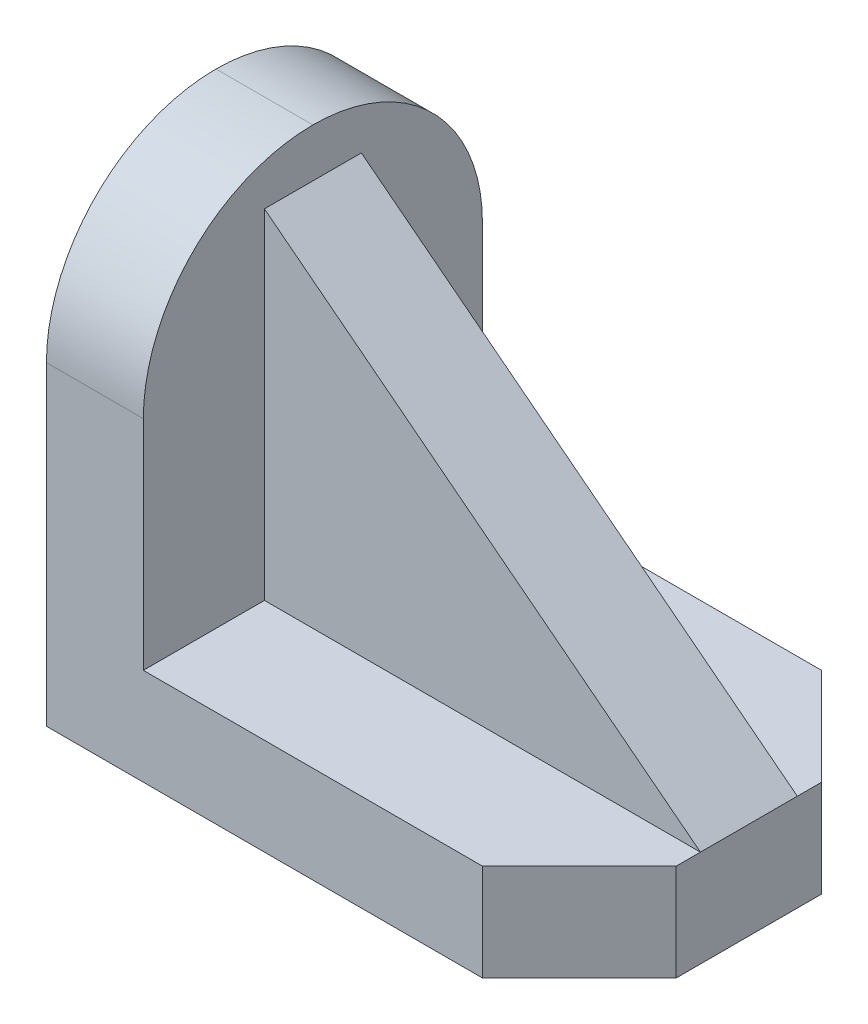
ISO-10303-21;
HEADER;
FILE_DESCRIPTION(('STEP AP214'),'2;1');
FILE_NAME('part.step','',(''),(''),'','','');
FILE_SCHEMA(('AUTOMOTIVE_DESIGN { 1 0 10303 214 1 1 1 1 }'));
ENDSEC;
DATA;
#1=APPLICATION_CONTEXT('core data for automotive mechanical design processes');
#2=APPLICATION_PROTOCOL_DEFINITION('international standard','automotive_design',2000,#1);
#3=PRODUCT_CONTEXT('',#1,'mechanical');
#4=PRODUCT('Part','Part','',(#3));
#5=PRODUCT_RELATED_PRODUCT_CATEGORY('part','',(#4));
#6=PRODUCT_DEFINITION_FORMATION('','',#4);
#7=PRODUCT_DEFINITION_CONTEXT('part definition',#1,'design');
#8=PRODUCT_DEFINITION('design','',#6,#7);
#9=PRODUCT_DEFINITION_SHAPE('','',#8);
#10=(LENGTH_UNIT() NAMED_UNIT(*) SI_UNIT(.MILLI.,.METRE.));
#11=(NAMED_UNIT(*) PLANE_ANGLE_UNIT() SI_UNIT($,.RADIAN.));
#12=(NAMED_UNIT(*) SI_UNIT($,.STERADIAN.) SOLID_ANGLE_UNIT());
#13=UNCERTAINTY_MEASURE_WITH_UNIT(LENGTH_MEASURE(1.E-05),#10,'distance_accuracy_value','');
#14=(GEOMETRIC_REPRESENTATION_CONTEXT(3) GLOBAL_UNCERTAINTY_ASSIGNED_CONTEXT((#13)) GLOBAL_UNIT_ASSIGNED_CONTEXT((#10,
#11,#12)) REPRESENTATION_CONTEXT('',''));
#15=CARTESIAN_POINT('',(0.,0.,0.));
#16=DIRECTION('',(0.,0.,1.));
#17=DIRECTION('',(1.,0.,0.));
#18=AXIS2_PLACEMENT_3D('',#15,#16,#17);
#19=CARTESIAN_POINT('',(0.,30.48,0.));
#20=DIRECTION('',(0.,1.,0.));
#21=DIRECTION('',(0.,0.,1.));
#22=AXIS2_PLACEMENT_3D('',#19,#20,#21);
#23=PLANE('',#22);
#24=DIRECTION('',(0.,0.,-1.));
#25=VECTOR('',#24,1.);
#26=CARTESIAN_POINT('',(30.48,30.48,0.));
#27=LINE('',#26,#25);
#28=CARTESIAN_POINT('',(30.48,30.48,-68.58));
#29=VERTEX_POINT('',#28);
#30=CARTESIAN_POINT('',(30.48,30.48,-106.68));
#31=VERTEX_POINT('',#30);
#32=EDGE_CURVE('E158',#29,#31,#27,.T.);
#33=ORIENTED_EDGE('',*,*,#32,.F.);
#34=DIRECTION('',(1.,0.,0.));
#35=VECTOR('',#34,1.);
#36=CARTESIAN_POINT('',(0.,30.48,-68.58));
#37=LINE('',#36,#35);
#38=CARTESIAN_POINT('',(167.64,30.48,-68.58));
#39=VERTEX_POINT('',#38);
#40=EDGE_CURVE('E151',#29,#39,#37,.T.);
#41=ORIENTED_EDGE('',*,*,#40,.T.);
#42=DIRECTION('',(0.,0.,-1.));
#43=VECTOR('',#42,1.);
#44=CARTESIAN_POINT('',(167.64,30.48,-30.4800000000001));
#45=LINE('',#44,#43);
#46=CARTESIAN_POINT('',(167.64,30.48,-76.2000000000001));
#47=VERTEX_POINT('',#46);
#48=EDGE_CURVE('E168',#39,#47,#45,.T.);
#49=ORIENTED_EDGE('',*,*,#48,.T.);
#50=DIRECTION('',(-0.707106781186549,0.,-0.707106781186546));
#51=VECTOR('',#50,1.);
#52=CARTESIAN_POINT('',(167.64,30.48,-76.2000000000001));
#53=LINE('',#52,#51);
#54=CARTESIAN_POINT('',(137.16,30.48,-106.68));
#55=VERTEX_POINT('',#54);
#56=EDGE_CURVE('E172',#47,#55,#53,.T.);
#57=ORIENTED_EDGE('',*,*,#56,.T.);
#58=DIRECTION('',(-1.,0.,0.));
#59=VECTOR('',#58,1.);
#60=CARTESIAN_POINT('',(137.16,30.48,-106.68));
#61=LINE('',#60,#59);
#62=EDGE_CURVE('E174',#55,#31,#61,.T.);
#63=ORIENTED_EDGE('',*,*,#62,.T.);
#64=EDGE_LOOP('',(#33,#41,#49,#57,#63));
#65=FACE_BOUND('',#64,.T.);
#66=ADVANCED_FACE('F43',(#65),#23,.T.);
#67=CARTESIAN_POINT('',(30.48,152.4,0.));
#68=DIRECTION('',(-1.,0.,0.));
#69=DIRECTION('',(0.,0.,1.));
#70=AXIS2_PLACEMENT_3D('',#67,#68,#69);
#71=PLANE('',#70);
#72=DIRECTION('',(0.,-1.,0.));
#73=VECTOR('',#72,1.);
#74=CARTESIAN_POINT('',(30.48,152.4,-106.68));
#75=LINE('',#74,#73);
#76=CARTESIAN_POINT('',(30.48,99.06,-106.68));
#77=VERTEX_POINT('',#76);
#78=EDGE_CURVE('E159',#77,#31,#75,.T.);
#79=ORIENTED_EDGE('',*,*,#78,.F.);
#80=CARTESIAN_POINT('',(30.48,99.06,-53.34));
#81=DIRECTION('',(-1.,0.,0.));
#82=DIRECTION('',(0.,0.,1.));
#83=AXIS2_PLACEMENT_3D('',#80,#81,#82);
#84=CIRCLE('',#83,53.34);
#85=CARTESIAN_POINT('',(30.48,152.4,-53.34));
#86=VERTEX_POINT('',#85);
#87=EDGE_CURVE('E63',#77,#86,#84,.F.);
#88=ORIENTED_EDGE('',*,*,#87,.T.);
#89=CARTESIAN_POINT('',(30.48,99.06,-53.34));
#90=DIRECTION('',(-1.,0.,0.));
#91=DIRECTION('',(0.,0.,1.));
#92=AXIS2_PLACEMENT_3D('',#89,#90,#91);
#93=CIRCLE('',#92,53.34);
#94=CARTESIAN_POINT('',(30.48,99.06,0.));
#95=VERTEX_POINT('',#94);
#96=EDGE_CURVE('E56',#86,#95,#93,.F.);
#97=ORIENTED_EDGE('',*,*,#96,.T.);
#98=DIRECTION('',(0.,-1.,0.));
#99=VECTOR('',#98,1.);
#100=CARTESIAN_POINT('',(30.48,152.4,0.));
#101=LINE('',#100,#99);
#102=CARTESIAN_POINT('',(30.48,30.48,0.));
#103=VERTEX_POINT('',#102);
#104=EDGE_CURVE('E165',#95,#103,#101,.T.);
#105=ORIENTED_EDGE('',*,*,#104,.T.);
#106=CARTESIAN_POINT('',(30.48,30.48,-38.1));
#107=VERTEX_POINT('',#106);
#108=EDGE_CURVE('E144',#103,#107,#27,.T.);
#109=ORIENTED_EDGE('',*,*,#108,.T.);
#110=DIRECTION('',(0.,-1.,0.));
#111=VECTOR('',#110,1.);
#112=CARTESIAN_POINT('',(30.48,137.16,-38.1));
#113=LINE('',#112,#111);
#114=CARTESIAN_POINT('',(30.48,137.16,-38.1));
#115=VERTEX_POINT('',#114);
#116=EDGE_CURVE('E135',#115,#107,#113,.T.);
#117=ORIENTED_EDGE('',*,*,#116,.F.);
#118=DIRECTION('',(0.,0.,-1.));
#119=VECTOR('',#118,1.);
#120=CARTESIAN_POINT('',(30.48,137.16,0.));
#121=LINE('',#120,#119);
#122=CARTESIAN_POINT('',(30.48,137.16,-68.58));
#123=VERTEX_POINT('',#122);
#124=EDGE_CURVE('E141',#115,#123,#121,.T.);
#125=ORIENTED_EDGE('',*,*,#124,.T.);
#126=DIRECTION('',(0.,-1.,0.));
#127=VECTOR('',#126,1.);
#128=CARTESIAN_POINT('',(30.48,137.16,-68.58));
#129=LINE('',#128,#127);
#130=EDGE_CURVE('E148',#123,#29,#129,.T.);
#131=ORIENTED_EDGE('',*,*,#130,.T.);
#132=ORIENTED_EDGE('',*,*,#32,.T.);
#133=EDGE_LOOP('',(#79,#88,#97,#105,#109,#117,#125,#131,#132));
#134=FACE_BOUND('',#133,.T.);
#135=ADVANCED_FACE('F143',(#134),#71,.F.);
#136=CARTESIAN_POINT('',(0.,30.48,-106.68));
#137=DIRECTION('',(1.,0.,0.));
#138=DIRECTION('',(0.,0.,-1.));
#139=AXIS2_PLACEMENT_3D('',#136,#137,#138);
#140=PLANE('',#139);
#141=CARTESIAN_POINT('',(0.,99.06,-53.34));
#142=DIRECTION('',(1.,0.,0.));
#143=DIRECTION('',(0.,0.,-1.));
#144=AXIS2_PLACEMENT_3D('',#141,#142,#143);
#145=CIRCLE('',#144,53.34);
#146=CARTESIAN_POINT('',(0.,99.06,0.));
#147=VERTEX_POINT('',#146);
#148=CARTESIAN_POINT('',(0.,152.4,-53.34));
#149=VERTEX_POINT('',#148);
#150=EDGE_CURVE('E206',#147,#149,#145,.F.);
#151=ORIENTED_EDGE('',*,*,#150,.T.);
#152=CARTESIAN_POINT('',(0.,99.06,-53.34));
#153=DIRECTION('',(1.,0.,0.));
#154=DIRECTION('',(0.,0.,-1.));
#155=AXIS2_PLACEMENT_3D('',#152,#153,#154);
#156=CIRCLE('',#155,53.34);
#157=CARTESIAN_POINT('',(0.,99.06,-106.68));
#158=VERTEX_POINT('',#157);
#159=EDGE_CURVE('E208',#149,#158,#156,.F.);
#160=ORIENTED_EDGE('',*,*,#159,.T.);
#161=DIRECTION('',(0.,-1.,0.));
#162=VECTOR('',#161,1.);
#163=CARTESIAN_POINT('',(0.,30.48,-106.68));
#164=LINE('',#163,#162);
#165=CARTESIAN_POINT('',(0.,0.,-106.68));
#166=VERTEX_POINT('',#165);
#167=EDGE_CURVE('E178',#158,#166,#164,.T.);
#168=ORIENTED_EDGE('',*,*,#167,.T.);
#169=DIRECTION('',(0.,0.,1.));
#170=VECTOR('',#169,1.);
#171=CARTESIAN_POINT('',(0.,0.,-106.68));
#172=LINE('',#171,#170);
#173=CARTESIAN_POINT('',(0.,0.,0.));
#174=VERTEX_POINT('',#173);
#175=EDGE_CURVE('E163',#166,#174,#172,.T.);
#176=ORIENTED_EDGE('',*,*,#175,.T.);
#177=DIRECTION('',(0.,-1.,0.));
#178=VECTOR('',#177,1.);
#179=CARTESIAN_POINT('',(0.,30.48,0.));
#180=LINE('',#179,#178);
#181=EDGE_CURVE('E204',#147,#174,#180,.T.);
#182=ORIENTED_EDGE('',*,*,#181,.F.);
#183=EDGE_LOOP('',(#151,#160,#168,#176,#182));
#184=FACE_BOUND('',#183,.T.);
#185=ADVANCED_FACE('F253',(#184),#140,.F.);
#186=CARTESIAN_POINT('',(0.,30.48,0.));
#187=DIRECTION('',(0.,0.,-1.));
#188=DIRECTION('',(-1.,0.,0.));
#189=AXIS2_PLACEMENT_3D('',#186,#187,#188);
#190=PLANE('',#189);
#191=ORIENTED_EDGE('',*,*,#104,.F.);
#192=DIRECTION('',(1.,0.,0.));
#193=VECTOR('',#192,1.);
#194=CARTESIAN_POINT('',(0.,99.06,0.));
#195=LINE('',#194,#193);
#196=EDGE_CURVE('E214',#95,#147,#195,.F.);
#197=ORIENTED_EDGE('',*,*,#196,.T.);
#198=ORIENTED_EDGE('',*,*,#181,.T.);
#199=DIRECTION('',(1.,0.,0.));
#200=VECTOR('',#199,1.);
#201=CARTESIAN_POINT('',(0.,0.,0.));
#202=LINE('',#201,#200);
#203=CARTESIAN_POINT('',(137.16,0.,0.));
#204=VERTEX_POINT('',#203);
#205=EDGE_CURVE('E182',#174,#204,#202,.T.);
#206=ORIENTED_EDGE('',*,*,#205,.T.);
#207=DIRECTION('',(0.,-1.,0.));
#208=VECTOR('',#207,1.);
#209=CARTESIAN_POINT('',(137.16,30.48,0.));
#210=LINE('',#209,#208);
#211=CARTESIAN_POINT('',(137.16,30.48,0.));
#212=VERTEX_POINT('',#211);
#213=EDGE_CURVE('E203',#212,#204,#210,.T.);
#214=ORIENTED_EDGE('',*,*,#213,.F.);
#215=DIRECTION('',(1.,0.,0.));
#216=VECTOR('',#215,1.);
#217=CARTESIAN_POINT('',(0.,30.48,0.));
#218=LINE('',#217,#216);
#219=EDGE_CURVE('E164',#103,#212,#218,.T.);
#220=ORIENTED_EDGE('',*,*,#219,.F.);
#221=EDGE_LOOP('',(#191,#197,#198,#206,#214,#220));
#222=FACE_BOUND('',#221,.T.);
#223=ADVANCED_FACE('F250',(#222),#190,.F.);
#224=CARTESIAN_POINT('',(137.16,30.48,0.));
#225=DIRECTION('',(-0.707106781186548,0.,-0.707106781186546));
#226=DIRECTION('',(-0.707106781186547,0.,0.707106781186549));
#227=AXIS2_PLACEMENT_3D('',#224,#225,#226);
#228=PLANE('',#227);
#229=DIRECTION('',(0.707106781186546,0.,-0.707106781186549));
#230=VECTOR('',#229,1.);
#231=CARTESIAN_POINT('',(137.16,0.,0.));
#232=LINE('',#231,#230);
#233=CARTESIAN_POINT('',(167.64,0.,-30.4800000000001));
#234=VERTEX_POINT('',#233);
#235=EDGE_CURVE('E181',#204,#234,#232,.T.);
#236=ORIENTED_EDGE('',*,*,#235,.T.);
#237=DIRECTION('',(0.,-1.,0.));
#238=VECTOR('',#237,1.);
#239=CARTESIAN_POINT('',(167.64,30.48,-30.4800000000001));
#240=LINE('',#239,#238);
#241=CARTESIAN_POINT('',(167.64,30.48,-30.4800000000001));
#242=VERTEX_POINT('',#241);
#243=EDGE_CURVE('E196',#242,#234,#240,.T.);
#244=ORIENTED_EDGE('',*,*,#243,.F.);
#245=DIRECTION('',(0.707106781186546,0.,-0.707106781186549));
#246=VECTOR('',#245,1.);
#247=CARTESIAN_POINT('',(137.16,30.48,0.));
#248=LINE('',#247,#246);
#249=EDGE_CURVE('E170',#212,#242,#248,.T.);
#250=ORIENTED_EDGE('',*,*,#249,.F.);
#251=ORIENTED_EDGE('',*,*,#213,.T.);
#252=EDGE_LOOP('',(#236,#244,#250,#251));
#253=FACE_BOUND('',#252,.T.);
#254=ADVANCED_FACE('F261',(#253),#228,.F.);
#255=CARTESIAN_POINT('',(167.64,30.48,-30.4800000000001));
#256=DIRECTION('',(-1.,0.,0.));
#257=DIRECTION('',(0.,0.,1.));
#258=AXIS2_PLACEMENT_3D('',#255,#256,#257);
#259=PLANE('',#258);
#260=ORIENTED_EDGE('',*,*,#48,.F.);
#261=DIRECTION('',(0.,0.,1.));
#262=VECTOR('',#261,1.);
#263=CARTESIAN_POINT('',(167.64,30.4799999999998,-38.1));
#264=LINE('',#263,#262);
#265=CARTESIAN_POINT('',(167.64,30.48,-38.1));
#266=VERTEX_POINT('',#265);
#267=EDGE_CURVE('E55',#39,#266,#264,.T.);
#268=ORIENTED_EDGE('',*,*,#267,.T.);
#269=EDGE_CURVE('E171',#242,#266,#45,.T.);
#270=ORIENTED_EDGE('',*,*,#269,.F.);
#271=ORIENTED_EDGE('',*,*,#243,.T.);
#272=DIRECTION('',(0.,0.,-1.));
#273=VECTOR('',#272,1.);
#274=CARTESIAN_POINT('',(167.64,0.,-30.4800000000001));
#275=LINE('',#274,#273);
#276=CARTESIAN_POINT('',(167.64,0.,-76.2000000000001));
#277=VERTEX_POINT('',#276);
#278=EDGE_CURVE('E183',#234,#277,#275,.T.);
#279=ORIENTED_EDGE('',*,*,#278,.T.);
#280=DIRECTION('',(0.,-1.,0.));
#281=VECTOR('',#280,1.);
#282=CARTESIAN_POINT('',(167.64,30.48,-76.2000000000001));
#283=LINE('',#282,#281);
#284=EDGE_CURVE('E191',#47,#277,#283,.T.);
#285=ORIENTED_EDGE('',*,*,#284,.F.);
#286=EDGE_LOOP('',(#260,#268,#270,#271,#279,#285));
#287=FACE_BOUND('',#286,.T.);
#288=ADVANCED_FACE('F225',(#287),#259,.F.);
#289=CARTESIAN_POINT('',(167.64,30.48,-76.2000000000001));
#290=DIRECTION('',(-0.707106781186546,0.,0.707106781186549));
#291=DIRECTION('',(0.707106781186549,0.,0.707106781186546));
#292=AXIS2_PLACEMENT_3D('',#289,#290,#291);
#293=PLANE('',#292);
#294=DIRECTION('',(-0.707106781186549,0.,-0.707106781186546));
#295=VECTOR('',#294,1.);
#296=CARTESIAN_POINT('',(167.64,0.,-76.2000000000001));
#297=LINE('',#296,#295);
#298=CARTESIAN_POINT('',(137.16,0.,-106.68));
#299=VERTEX_POINT('',#298);
#300=EDGE_CURVE('E190',#277,#299,#297,.T.);
#301=ORIENTED_EDGE('',*,*,#300,.T.);
#302=DIRECTION('',(0.,-1.,0.));
#303=VECTOR('',#302,1.);
#304=CARTESIAN_POINT('',(137.16,30.48,-106.68));
#305=LINE('',#304,#303);
#306=EDGE_CURVE('E195',#55,#299,#305,.T.);
#307=ORIENTED_EDGE('',*,*,#306,.F.);
#308=ORIENTED_EDGE('',*,*,#56,.F.);
#309=ORIENTED_EDGE('',*,*,#284,.T.);
#310=EDGE_LOOP('',(#301,#307,#308,#309));
#311=FACE_BOUND('',#310,.T.);
#312=ADVANCED_FACE('F273',(#311),#293,.F.);
#313=CARTESIAN_POINT('',(137.16,30.48,-106.68));
#314=DIRECTION('',(0.,0.,1.));
#315=DIRECTION('',(1.,0.,0.));
#316=AXIS2_PLACEMENT_3D('',#313,#314,#315);
#317=PLANE('',#316);
#318=ORIENTED_EDGE('',*,*,#167,.F.);
#319=DIRECTION('',(-1.,0.,0.));
#320=VECTOR('',#319,1.);
#321=CARTESIAN_POINT('',(30.48,99.06,-106.68));
#322=LINE('',#321,#320);
#323=EDGE_CURVE('E209',#158,#77,#322,.F.);
#324=ORIENTED_EDGE('',*,*,#323,.T.);
#325=ORIENTED_EDGE('',*,*,#78,.T.);
#326=ORIENTED_EDGE('',*,*,#62,.F.);
#327=ORIENTED_EDGE('',*,*,#306,.T.);
#328=DIRECTION('',(-1.,0.,0.));
#329=VECTOR('',#328,1.);
#330=CARTESIAN_POINT('',(137.16,0.,-106.68));
#331=LINE('',#330,#329);
#332=EDGE_CURVE('E169',#299,#166,#331,.T.);
#333=ORIENTED_EDGE('',*,*,#332,.T.);
#334=EDGE_LOOP('',(#318,#324,#325,#326,#327,#333));
#335=FACE_BOUND('',#334,.T.);
#336=ADVANCED_FACE('F234',(#335),#317,.F.);
#337=DIRECTION('',(1.,0.,0.));
#338=VECTOR('',#337,1.);
#339=CARTESIAN_POINT('',(0.,30.48,-38.1));
#340=LINE('',#339,#338);
#341=EDGE_CURVE('E133',#107,#266,#340,.T.);
#342=ORIENTED_EDGE('',*,*,#341,.F.);
#343=ORIENTED_EDGE('',*,*,#108,.F.);
#344=ORIENTED_EDGE('',*,*,#219,.T.);
#345=ORIENTED_EDGE('',*,*,#249,.T.);
#346=ORIENTED_EDGE('',*,*,#269,.T.);
#347=EDGE_LOOP('',(#342,#343,#344,#345,#346));
#348=FACE_BOUND('',#347,.T.);
#349=ADVANCED_FACE('F262',(#348),#23,.T.);
#350=CARTESIAN_POINT('',(0.,0.,0.));
#351=DIRECTION('',(0.,1.,0.));
#352=DIRECTION('',(0.,0.,1.));
#353=AXIS2_PLACEMENT_3D('',#350,#351,#352);
#354=PLANE('',#353);
#355=ORIENTED_EDGE('',*,*,#175,.F.);
#356=ORIENTED_EDGE('',*,*,#332,.F.);
#357=ORIENTED_EDGE('',*,*,#300,.F.);
#358=ORIENTED_EDGE('',*,*,#278,.F.);
#359=ORIENTED_EDGE('',*,*,#235,.F.);
#360=ORIENTED_EDGE('',*,*,#205,.F.);
#361=EDGE_LOOP('',(#355,#356,#357,#358,#359,#360));
#362=FACE_BOUND('',#361,.T.);
#363=ADVANCED_FACE('F255',(#362),#354,.F.);
#364=CARTESIAN_POINT('',(0.,137.16,-68.58));
#365=DIRECTION('',(0.,0.,-1.));
#366=DIRECTION('',(-1.,0.,0.));
#367=AXIS2_PLACEMENT_3D('',#364,#365,#366);
#368=PLANE('',#367);
#369=ORIENTED_EDGE('',*,*,#130,.F.);
#370=DIRECTION('',(0.789352217376327,-0.61394061351492,0.));
#371=VECTOR('',#370,1.);
#372=CARTESIAN_POINT('',(11.4886153846152,151.931076923077,-68.58));
#373=LINE('',#372,#371);
#374=EDGE_CURVE('E146',#123,#39,#373,.T.);
#375=ORIENTED_EDGE('',*,*,#374,.T.);
#376=ORIENTED_EDGE('',*,*,#40,.F.);
#377=EDGE_LOOP('',(#369,#375,#376));
#378=FACE_BOUND('',#377,.T.);
#379=ADVANCED_FACE('F229',(#378),#368,.T.);
#380=CARTESIAN_POINT('',(0.,137.16,-38.1));
#381=DIRECTION('',(0.,0.,-1.));
#382=DIRECTION('',(-1.,0.,0.));
#383=AXIS2_PLACEMENT_3D('',#380,#381,#382);
#384=PLANE('',#383);
#385=ORIENTED_EDGE('',*,*,#341,.T.);
#386=DIRECTION('',(-0.789352217376327,0.61394061351492,0.));
#387=VECTOR('',#386,1.);
#388=CARTESIAN_POINT('',(30.4799999999995,137.16,-38.1));
#389=LINE('',#388,#387);
#390=EDGE_CURVE('E11',#266,#115,#389,.T.);
#391=ORIENTED_EDGE('',*,*,#390,.T.);
#392=ORIENTED_EDGE('',*,*,#116,.T.);
#393=EDGE_LOOP('',(#385,#391,#392));
#394=FACE_BOUND('',#393,.T.);
#395=ADVANCED_FACE('F131',(#394),#384,.F.);
#396=CARTESIAN_POINT('',(0.,99.06,-53.34));
#397=DIRECTION('',(-1.,0.,0.));
#398=DIRECTION('',(0.,0.,1.));
#399=AXIS2_PLACEMENT_3D('',#396,#397,#398);
#400=CYLINDRICAL_SURFACE('',#399,53.34);
#401=ORIENTED_EDGE('',*,*,#196,.F.);
#402=ORIENTED_EDGE('',*,*,#96,.F.);
#403=DIRECTION('',(1.,0.,0.));
#404=VECTOR('',#403,1.);
#405=CARTESIAN_POINT('',(30.48,152.4,-53.34));
#406=LINE('',#405,#404);
#407=EDGE_CURVE('E154',#149,#86,#406,.T.);
#408=ORIENTED_EDGE('',*,*,#407,.F.);
#409=ORIENTED_EDGE('',*,*,#150,.F.);
#410=EDGE_LOOP('',(#401,#402,#408,#409));
#411=FACE_BOUND('',#410,.T.);
#412=ADVANCED_FACE('F243',(#411),#400,.T.);
#413=CARTESIAN_POINT('',(0.,99.06,-53.34));
#414=DIRECTION('',(1.,0.,0.));
#415=DIRECTION('',(0.,0.,-1.));
#416=AXIS2_PLACEMENT_3D('',#413,#414,#415);
#417=CYLINDRICAL_SURFACE('',#416,53.34);
#418=ORIENTED_EDGE('',*,*,#87,.F.);
#419=ORIENTED_EDGE('',*,*,#323,.F.);
#420=ORIENTED_EDGE('',*,*,#159,.F.);
#421=ORIENTED_EDGE('',*,*,#407,.T.);
#422=EDGE_LOOP('',(#418,#419,#420,#421));
#423=FACE_BOUND('',#422,.T.);
#424=ADVANCED_FACE('F239',(#423),#417,.T.);
#425=CARTESIAN_POINT('',(30.4799999999995,137.16,0.));
#426=DIRECTION('',(0.61394061351492,0.789352217376327,0.));
#427=DIRECTION('',(0.,0.,1.));
#428=AXIS2_PLACEMENT_3D('',#425,#426,#427);
#429=PLANE('',#428);
#430=ORIENTED_EDGE('',*,*,#390,.F.);
#431=ORIENTED_EDGE('',*,*,#267,.F.);
#432=ORIENTED_EDGE('',*,*,#374,.F.);
#433=ORIENTED_EDGE('',*,*,#124,.F.);
#434=EDGE_LOOP('',(#430,#431,#432,#433));
#435=FACE_BOUND('',#434,.T.);
#436=ADVANCED_FACE('F46',(#435),#429,.T.);
#437=CLOSED_SHELL('',(#66,#135,#185,#223,#254,#288,#312,#336,#349,#363,#379,#395,#412,#424,#436));
#438=MANIFOLD_SOLID_BREP('B2',#437);
#439=ADVANCED_BREP_SHAPE_REPRESENTATION('',(#18,#438),#14);
#440=SHAPE_DEFINITION_REPRESENTATION(#9,#439);
ENDSEC;
END-ISO-10303-21;
